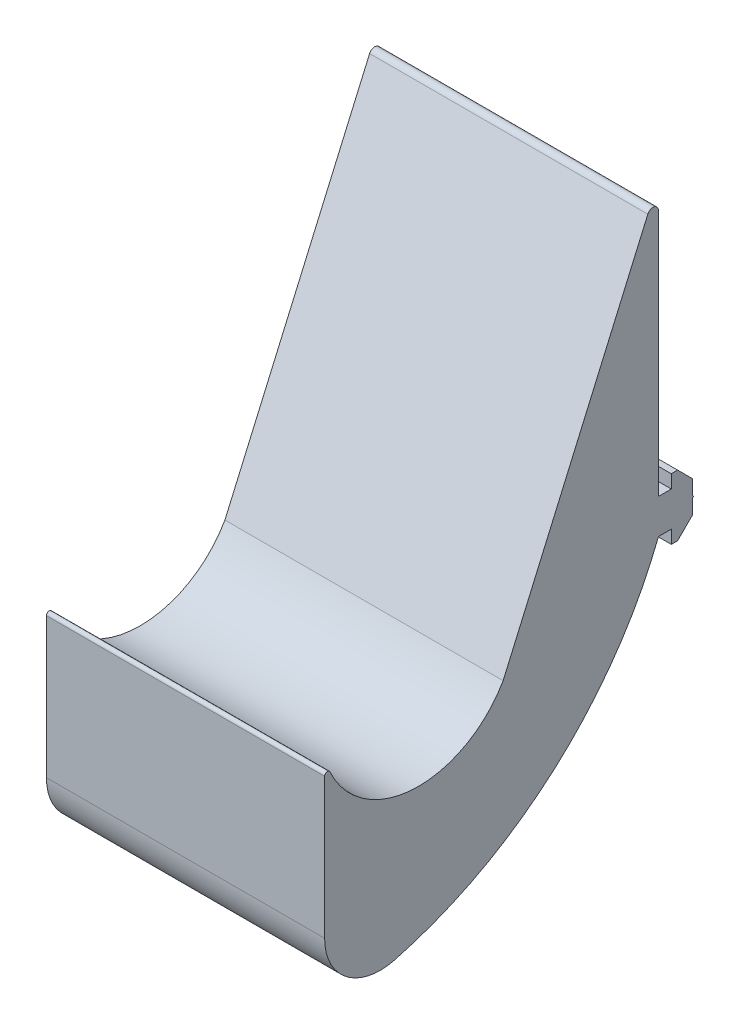
ISO-10303-21;
HEADER;
FILE_DESCRIPTION(('STEP AP214'),'2;1');
FILE_NAME('part.step','',(''),(''),'','','');
FILE_SCHEMA(('AUTOMOTIVE_DESIGN { 1 0 10303 214 1 1 1 1 }'));
ENDSEC;
DATA;
#1=APPLICATION_CONTEXT('core data for automotive mechanical design processes');
#2=APPLICATION_PROTOCOL_DEFINITION('international standard','automotive_design',2000,#1);
#3=PRODUCT_CONTEXT('',#1,'mechanical');
#4=PRODUCT('Part','Part','',(#3));
#5=PRODUCT_RELATED_PRODUCT_CATEGORY('part','',(#4));
#6=PRODUCT_DEFINITION_FORMATION('','',#4);
#7=PRODUCT_DEFINITION_CONTEXT('part definition',#1,'design');
#8=PRODUCT_DEFINITION('design','',#6,#7);
#9=PRODUCT_DEFINITION_SHAPE('','',#8);
#10=(LENGTH_UNIT() NAMED_UNIT(*) SI_UNIT(.MILLI.,.METRE.));
#11=(NAMED_UNIT(*) PLANE_ANGLE_UNIT() SI_UNIT($,.RADIAN.));
#12=(NAMED_UNIT(*) SI_UNIT($,.STERADIAN.) SOLID_ANGLE_UNIT());
#13=UNCERTAINTY_MEASURE_WITH_UNIT(LENGTH_MEASURE(1.E-05),#10,'distance_accuracy_value','');
#14=(GEOMETRIC_REPRESENTATION_CONTEXT(3) GLOBAL_UNCERTAINTY_ASSIGNED_CONTEXT((#13)) GLOBAL_UNIT_ASSIGNED_CONTEXT((#10,
#11,#12)) REPRESENTATION_CONTEXT('',''));
#15=CARTESIAN_POINT('',(0.,0.,0.));
#16=DIRECTION('',(0.,0.,1.));
#17=DIRECTION('',(1.,0.,0.));
#18=AXIS2_PLACEMENT_3D('',#15,#16,#17);
#19=CARTESIAN_POINT('',(50.,-50.,-30.));
#20=DIRECTION('',(0.,0.,1.));
#21=DIRECTION('',(1.,0.,0.));
#22=AXIS2_PLACEMENT_3D('',#19,#20,#21);
#23=PLANE('',#22);
#24=DIRECTION('',(1.,0.,0.));
#25=VECTOR('',#24,1.);
#26=CARTESIAN_POINT('',(0.,0.728575995623113,-30.));
#27=LINE('',#26,#25);
#28=CARTESIAN_POINT('',(0.,0.728575995623113,-30.));
#29=VERTEX_POINT('',#28);
#30=CARTESIAN_POINT('',(50.,0.728575995623114,-30.));
#31=VERTEX_POINT('',#30);
#32=EDGE_CURVE('E265',#29,#31,#27,.T.);
#33=ORIENTED_EDGE('',*,*,#32,.F.);
#34=DIRECTION('',(0.,1.,0.));
#35=VECTOR('',#34,1.);
#36=CARTESIAN_POINT('',(0.,-50.,-30.));
#37=LINE('',#36,#35);
#38=CARTESIAN_POINT('',(0.,45.2071519912462,-30.));
#39=VERTEX_POINT('',#38);
#40=EDGE_CURVE('E281',#29,#39,#37,.T.);
#41=ORIENTED_EDGE('',*,*,#40,.T.);
#42=DIRECTION('',(-1.,0.,0.));
#43=VECTOR('',#42,1.);
#44=CARTESIAN_POINT('',(50.,45.2071519912462,-30.));
#45=LINE('',#44,#43);
#46=CARTESIAN_POINT('',(50.,45.2071519912462,-30.));
#47=VERTEX_POINT('',#46);
#48=EDGE_CURVE('E305',#39,#47,#45,.F.);
#49=ORIENTED_EDGE('',*,*,#48,.T.);
#50=DIRECTION('',(0.,1.,0.));
#51=VECTOR('',#50,1.);
#52=CARTESIAN_POINT('',(50.,-50.,-30.));
#53=LINE('',#52,#51);
#54=EDGE_CURVE('E286',#31,#47,#53,.T.);
#55=ORIENTED_EDGE('',*,*,#54,.F.);
#56=EDGE_LOOP('',(#33,#41,#49,#55));
#57=FACE_BOUND('',#56,.T.);
#58=ADVANCED_FACE('F35',(#57),#23,.F.);
#59=CARTESIAN_POINT('',(50.,-13.9958230261597,-2.0798525217997));
#60=DIRECTION('',(0.,-0.399880657890276,-0.916567214908563));
#61=DIRECTION('',(0.,0.916567214908563,-0.399880657890276));
#62=AXIS2_PLACEMENT_3D('',#59,#60,#61);
#63=PLANE('',#62);
#64=DIRECTION('',(0.,-0.916567214908563,0.399880657890276));
#65=VECTOR('',#64,1.);
#66=CARTESIAN_POINT('',(50.,-13.9958230261597,-2.0798525217997));
#67=LINE('',#66,#65);
#68=CARTESIAN_POINT('',(50.,45.6070326491365,-28.0834327850914));
#69=VERTEX_POINT('',#68);
#70=CARTESIAN_POINT('',(50.,-13.9958230261597,-2.0798525217997));
#71=VERTEX_POINT('',#70);
#72=EDGE_CURVE('E278',#69,#71,#67,.T.);
#73=ORIENTED_EDGE('',*,*,#72,.F.);
#74=DIRECTION('',(-1.,0.,0.));
#75=VECTOR('',#74,1.);
#76=CARTESIAN_POINT('',(50.,45.6070326491365,-28.0834327850914));
#77=LINE('',#76,#75);
#78=CARTESIAN_POINT('',(0.,45.6070326491365,-28.0834327850914));
#79=VERTEX_POINT('',#78);
#80=EDGE_CURVE('E299',#69,#79,#77,.T.);
#81=ORIENTED_EDGE('',*,*,#80,.T.);
#82=DIRECTION('',(0.,-0.916567214908563,0.399880657890276));
#83=VECTOR('',#82,1.);
#84=CARTESIAN_POINT('',(0.,-13.9958230261597,-2.0798525217997));
#85=LINE('',#84,#83);
#86=CARTESIAN_POINT('',(0.,-13.9958230261597,-2.0798525217997));
#87=VERTEX_POINT('',#86);
#88=EDGE_CURVE('E251',#79,#87,#85,.T.);
#89=ORIENTED_EDGE('',*,*,#88,.T.);
#90=DIRECTION('',(-1.,0.,0.));
#91=VECTOR('',#90,1.);
#92=CARTESIAN_POINT('',(50.,-13.9958230261597,-2.0798525217997));
#93=LINE('',#92,#91);
#94=EDGE_CURVE('E288',#71,#87,#93,.T.);
#95=ORIENTED_EDGE('',*,*,#94,.F.);
#96=EDGE_LOOP('',(#73,#81,#89,#95));
#97=FACE_BOUND('',#96,.T.);
#98=ADVANCED_FACE('F348',(#97),#63,.F.);
#99=CARTESIAN_POINT('',(50.,-5.34269309762879,13.1311087377645));
#100=DIRECTION('',(-1.,0.,0.));
#101=DIRECTION('',(0.,0.,1.));
#102=AXIS2_PLACEMENT_3D('',#99,#100,#101);
#103=CYLINDRICAL_SURFACE('',#102,17.5);
#104=CARTESIAN_POINT('',(0.,-5.34269309762879,13.1311087377645));
#105=DIRECTION('',(-1.,0.,0.));
#106=DIRECTION('',(0.,0.,-1.));
#107=AXIS2_PLACEMENT_3D('',#104,#105,#106);
#108=CIRCLE('',#107,17.5);
#109=CARTESIAN_POINT('',(0.,-12.6219955028834,29.045308576049));
#110=VERTEX_POINT('',#109);
#111=EDGE_CURVE('E290',#87,#110,#108,.T.);
#112=ORIENTED_EDGE('',*,*,#111,.T.);
#113=DIRECTION('',(-1.,0.,0.));
#114=VECTOR('',#113,1.);
#115=CARTESIAN_POINT('',(50.,-12.6219955028834,29.045308576049));
#116=LINE('',#115,#114);
#117=CARTESIAN_POINT('',(50.,-12.6219955028834,29.045308576049));
#118=VERTEX_POINT('',#117);
#119=EDGE_CURVE('E315',#110,#118,#116,.F.);
#120=ORIENTED_EDGE('',*,*,#119,.T.);
#121=CARTESIAN_POINT('',(50.,-5.34269309762879,13.1311087377645));
#122=DIRECTION('',(-1.,0.,0.));
#123=DIRECTION('',(0.,0.,-1.));
#124=AXIS2_PLACEMENT_3D('',#121,#122,#123);
#125=CIRCLE('',#124,17.5);
#126=EDGE_CURVE('E280',#71,#118,#125,.T.);
#127=ORIENTED_EDGE('',*,*,#126,.F.);
#128=ORIENTED_EDGE('',*,*,#94,.T.);
#129=EDGE_LOOP('',(#112,#120,#127,#128));
#130=FACE_BOUND('',#129,.T.);
#131=ADVANCED_FACE('F354',(#130),#103,.F.);
#132=CARTESIAN_POINT('',(50.,-50.,30.));
#133=DIRECTION('',(0.,0.,-1.));
#134=DIRECTION('',(0.,1.,0.));
#135=AXIS2_PLACEMENT_3D('',#132,#133,#134);
#136=PLANE('',#135);
#137=DIRECTION('',(0.,-1.,0.));
#138=VECTOR('',#137,1.);
#139=CARTESIAN_POINT('',(0.,-50.,30.));
#140=LINE('',#139,#138);
#141=CARTESIAN_POINT('',(0.,-12.8299755716049,30.));
#142=VERTEX_POINT('',#141);
#143=CARTESIAN_POINT('',(0.,-38.0475262971483,30.));
#144=VERTEX_POINT('',#143);
#145=EDGE_CURVE('E293',#142,#144,#140,.T.);
#146=ORIENTED_EDGE('',*,*,#145,.T.);
#147=DIRECTION('',(-1.,0.,0.));
#148=VECTOR('',#147,1.);
#149=CARTESIAN_POINT('',(50.,-38.0475262971483,30.));
#150=LINE('',#149,#148);
#151=CARTESIAN_POINT('',(50.,-38.0475262971483,30.));
#152=VERTEX_POINT('',#151);
#153=EDGE_CURVE('E323',#144,#152,#150,.F.);
#154=ORIENTED_EDGE('',*,*,#153,.T.);
#155=DIRECTION('',(0.,-1.,0.));
#156=VECTOR('',#155,1.);
#157=CARTESIAN_POINT('',(50.,-50.,30.));
#158=LINE('',#157,#156);
#159=CARTESIAN_POINT('',(50.,-12.8299755716049,30.));
#160=VERTEX_POINT('',#159);
#161=EDGE_CURVE('E284',#160,#152,#158,.T.);
#162=ORIENTED_EDGE('',*,*,#161,.F.);
#163=DIRECTION('',(-1.,0.,0.));
#164=VECTOR('',#163,1.);
#165=CARTESIAN_POINT('',(50.,-12.8299755716049,30.));
#166=LINE('',#165,#164);
#167=EDGE_CURVE('E310',#160,#142,#166,.T.);
#168=ORIENTED_EDGE('',*,*,#167,.T.);
#169=EDGE_LOOP('',(#146,#154,#162,#168));
#170=FACE_BOUND('',#169,.T.);
#171=ADVANCED_FACE('F329',(#170),#136,.F.);
#172=CARTESIAN_POINT('',(50.,-5.34269309762879,13.1311087377645));
#173=DIRECTION('',(1.,0.,0.));
#174=DIRECTION('',(0.,0.,-1.));
#175=AXIS2_PLACEMENT_3D('',#172,#173,#174);
#176=PLANE('',#175);
#177=ORIENTED_EDGE('',*,*,#161,.T.);
#178=CARTESIAN_POINT('',(50.,-38.0475262971483,20.));
#179=DIRECTION('',(1.,0.,0.));
#180=DIRECTION('',(0.,0.,-1.));
#181=AXIS2_PLACEMENT_3D('',#178,#179,#180);
#182=CIRCLE('',#181,10.);
#183=CARTESIAN_POINT('',(50.,-47.7221140133396,17.4697129566551));
#184=VERTEX_POINT('',#183);
#185=EDGE_CURVE('E57',#152,#184,#182,.T.);
#186=ORIENTED_EDGE('',*,*,#185,.T.);
#187=CARTESIAN_POINT('',(50.,20.,35.1817222600693));
#188=DIRECTION('',(1.,0.,0.));
#189=DIRECTION('',(0.,0.,-1.));
#190=AXIS2_PLACEMENT_3D('',#187,#188,#189);
#191=CIRCLE('',#190,70.);
#192=CARTESIAN_POINT('',(50.,-5.5214240043769,-30.));
#193=VERTEX_POINT('',#192);
#194=EDGE_CURVE('E321',#184,#193,#191,.T.);
#195=ORIENTED_EDGE('',*,*,#194,.T.);
#196=DIRECTION('',(0.,0.,-1.));
#197=VECTOR('',#196,1.);
#198=CARTESIAN_POINT('',(50.,-5.5214240043769,0.));
#199=LINE('',#198,#197);
#200=CARTESIAN_POINT('',(50.,-5.5214240043769,-32.3));
#201=VERTEX_POINT('',#200);
#202=EDGE_CURVE('E238',#193,#201,#199,.T.);
#203=ORIENTED_EDGE('',*,*,#202,.T.);
#204=DIRECTION('',(0.,-1.,0.));
#205=VECTOR('',#204,1.);
#206=CARTESIAN_POINT('',(50.,0.,-32.3));
#207=LINE('',#206,#205);
#208=CARTESIAN_POINT('',(50.,-7.89642400437688,-32.3));
#209=VERTEX_POINT('',#208);
#210=EDGE_CURVE('E241',#201,#209,#207,.T.);
#211=ORIENTED_EDGE('',*,*,#210,.T.);
#212=DIRECTION('',(0.,0.,1.));
#213=VECTOR('',#212,1.);
#214=CARTESIAN_POINT('',(50.,-7.89642400437703,0.));
#215=LINE('',#214,#213);
#216=CARTESIAN_POINT('',(50.,-7.89642400437688,-33.4393398282203));
#217=VERTEX_POINT('',#216);
#218=EDGE_CURVE('E244',#217,#209,#215,.T.);
#219=ORIENTED_EDGE('',*,*,#218,.F.);
#220=DIRECTION('',(0.,-0.707106781186554,0.707106781186541));
#221=VECTOR('',#220,1.);
#222=CARTESIAN_POINT('',(50.,-20.6678819162985,-20.6678819162989));
#223=LINE('',#222,#221);
#224=CARTESIAN_POINT('',(50.,-5.23576383259709,-36.1));
#225=VERTEX_POINT('',#224);
#226=EDGE_CURVE('E247',#225,#217,#223,.T.);
#227=ORIENTED_EDGE('',*,*,#226,.F.);
#228=DIRECTION('',(0.,-1.,0.));
#229=VECTOR('',#228,1.);
#230=CARTESIAN_POINT('',(50.,1.90537614988025E-13,-36.1));
#231=LINE('',#230,#229);
#232=CARTESIAN_POINT('',(50.,-2.60642400437688,-36.1));
#233=VERTEX_POINT('',#232);
#234=EDGE_CURVE('E190',#233,#225,#231,.T.);
#235=ORIENTED_EDGE('',*,*,#234,.F.);
#236=DIRECTION('',(0.,-0.70710678118655,0.707106781186545));
#237=VECTOR('',#236,1.);
#238=CARTESIAN_POINT('',(50.,-19.3532120021884,-19.3532120021885));
#239=LINE('',#238,#237);
#240=CARTESIAN_POINT('',(50.,-2.39642400437687,-36.31));
#241=VERTEX_POINT('',#240);
#242=EDGE_CURVE('E221',#241,#233,#239,.T.);
#243=ORIENTED_EDGE('',*,*,#242,.F.);
#244=DIRECTION('',(0.,0.707106781186548,0.707106781186548));
#245=VECTOR('',#244,1.);
#246=CARTESIAN_POINT('',(50.,16.9567879978116,-16.9567879978116));
#247=LINE('',#246,#245);
#248=CARTESIAN_POINT('',(50.,-2.18642400437687,-36.1));
#249=VERTEX_POINT('',#248);
#250=EDGE_CURVE('E176',#241,#249,#247,.T.);
#251=ORIENTED_EDGE('',*,*,#250,.T.);
#252=DIRECTION('',(0.,1.,0.));
#253=VECTOR('',#252,1.);
#254=CARTESIAN_POINT('',(50.,0.,-36.1));
#255=LINE('',#254,#253);
#256=CARTESIAN_POINT('',(50.,0.442915823843343,-36.1));
#257=VERTEX_POINT('',#256);
#258=EDGE_CURVE('E224',#249,#257,#255,.T.);
#259=ORIENTED_EDGE('',*,*,#258,.T.);
#260=DIRECTION('',(0.,0.707106781186549,0.707106781186546));
#261=VECTOR('',#260,1.);
#262=CARTESIAN_POINT('',(50.,18.2714579119217,-18.2714579119217));
#263=LINE('',#262,#261);
#264=CARTESIAN_POINT('',(50.,3.10357599562312,-33.4393398282202));
#265=VERTEX_POINT('',#264);
#266=EDGE_CURVE('E227',#257,#265,#263,.T.);
#267=ORIENTED_EDGE('',*,*,#266,.T.);
#268=DIRECTION('',(0.,0.,1.));
#269=VECTOR('',#268,1.);
#270=CARTESIAN_POINT('',(50.,3.10357599562299,0.));
#271=LINE('',#270,#269);
#272=CARTESIAN_POINT('',(50.,3.1035759956231,-32.3));
#273=VERTEX_POINT('',#272);
#274=EDGE_CURVE('E230',#265,#273,#271,.T.);
#275=ORIENTED_EDGE('',*,*,#274,.T.);
#276=DIRECTION('',(0.,1.,0.));
#277=VECTOR('',#276,1.);
#278=CARTESIAN_POINT('',(50.,2.83106871279417E-13,-32.3));
#279=LINE('',#278,#277);
#280=CARTESIAN_POINT('',(50.,0.728575995623121,-32.3));
#281=VERTEX_POINT('',#280);
#282=EDGE_CURVE('E233',#281,#273,#279,.T.);
#283=ORIENTED_EDGE('',*,*,#282,.F.);
#284=DIRECTION('',(0.,0.,-1.));
#285=VECTOR('',#284,1.);
#286=CARTESIAN_POINT('',(50.,0.728575995622889,0.));
#287=LINE('',#286,#285);
#288=EDGE_CURVE('E236',#31,#281,#287,.T.);
#289=ORIENTED_EDGE('',*,*,#288,.F.);
#290=ORIENTED_EDGE('',*,*,#54,.T.);
#291=CARTESIAN_POINT('',(50.,45.2071519912462,-29.));
#292=DIRECTION('',(1.,0.,0.));
#293=DIRECTION('',(0.,0.,-1.));
#294=AXIS2_PLACEMENT_3D('',#291,#292,#293);
#295=CIRCLE('',#294,1.);
#296=EDGE_CURVE('E308',#47,#69,#295,.T.);
#297=ORIENTED_EDGE('',*,*,#296,.T.);
#298=ORIENTED_EDGE('',*,*,#72,.T.);
#299=ORIENTED_EDGE('',*,*,#126,.T.);
#300=CARTESIAN_POINT('',(50.,-12.8299755716049,29.5));
#301=DIRECTION('',(1.,0.,0.));
#302=DIRECTION('',(0.,0.,-1.));
#303=AXIS2_PLACEMENT_3D('',#300,#301,#302);
#304=CIRCLE('',#303,0.5);
#305=EDGE_CURVE('E317',#118,#160,#304,.T.);
#306=ORIENTED_EDGE('',*,*,#305,.T.);
#307=EDGE_LOOP('',(#177,#186,#195,#203,#211,#219,#227,#235,#243,#251,#259,#267,#275,#283,#289,
#290,#297,#298,#299,#306));
#308=FACE_BOUND('',#307,.T.);
#309=ADVANCED_FACE('F334',(#308),#176,.T.);
#310=CARTESIAN_POINT('',(0.,-5.34269309762879,13.1311087377645));
#311=DIRECTION('',(1.,0.,0.));
#312=DIRECTION('',(0.,0.,-1.));
#313=AXIS2_PLACEMENT_3D('',#310,#311,#312);
#314=PLANE('',#313);
#315=CARTESIAN_POINT('',(0.,20.,35.1817222600693));
#316=DIRECTION('',(1.,0.,0.));
#317=DIRECTION('',(0.,0.,-1.));
#318=AXIS2_PLACEMENT_3D('',#315,#316,#317);
#319=CIRCLE('',#318,70.);
#320=CARTESIAN_POINT('',(0.,-5.5214240043769,-30.));
#321=VERTEX_POINT('',#320);
#322=CARTESIAN_POINT('',(0.,-47.7221140133396,17.4697129566551));
#323=VERTEX_POINT('',#322);
#324=EDGE_CURVE('E319',#321,#323,#319,.F.);
#325=ORIENTED_EDGE('',*,*,#324,.T.);
#326=CARTESIAN_POINT('',(0.,-38.0475262971483,20.));
#327=DIRECTION('',(1.,0.,0.));
#328=DIRECTION('',(0.,0.,-1.));
#329=AXIS2_PLACEMENT_3D('',#326,#327,#328);
#330=CIRCLE('',#329,10.);
#331=EDGE_CURVE('E11',#323,#144,#330,.F.);
#332=ORIENTED_EDGE('',*,*,#331,.T.);
#333=ORIENTED_EDGE('',*,*,#145,.F.);
#334=CARTESIAN_POINT('',(0.,-12.8299755716049,29.5));
#335=DIRECTION('',(1.,0.,0.));
#336=DIRECTION('',(0.,0.,-1.));
#337=AXIS2_PLACEMENT_3D('',#334,#335,#336);
#338=CIRCLE('',#337,0.5);
#339=EDGE_CURVE('E313',#142,#110,#338,.F.);
#340=ORIENTED_EDGE('',*,*,#339,.T.);
#341=ORIENTED_EDGE('',*,*,#111,.F.);
#342=ORIENTED_EDGE('',*,*,#88,.F.);
#343=CARTESIAN_POINT('',(0.,45.2071519912462,-29.));
#344=DIRECTION('',(1.,0.,0.));
#345=DIRECTION('',(0.,0.,-1.));
#346=AXIS2_PLACEMENT_3D('',#343,#344,#345);
#347=CIRCLE('',#346,1.);
#348=EDGE_CURVE('E302',#79,#39,#347,.F.);
#349=ORIENTED_EDGE('',*,*,#348,.T.);
#350=ORIENTED_EDGE('',*,*,#40,.F.);
#351=DIRECTION('',(0.,0.,-1.));
#352=VECTOR('',#351,1.);
#353=CARTESIAN_POINT('',(0.,0.728575995622889,0.));
#354=LINE('',#353,#352);
#355=CARTESIAN_POINT('',(0.,0.728575995623121,-32.3));
#356=VERTEX_POINT('',#355);
#357=EDGE_CURVE('E208',#29,#356,#354,.T.);
#358=ORIENTED_EDGE('',*,*,#357,.T.);
#359=DIRECTION('',(0.,1.,0.));
#360=VECTOR('',#359,1.);
#361=CARTESIAN_POINT('',(0.,2.83106871279417E-13,-32.3));
#362=LINE('',#361,#360);
#363=CARTESIAN_POINT('',(0.,3.1035759956231,-32.3));
#364=VERTEX_POINT('',#363);
#365=EDGE_CURVE('E206',#356,#364,#362,.T.);
#366=ORIENTED_EDGE('',*,*,#365,.T.);
#367=DIRECTION('',(0.,0.,1.));
#368=VECTOR('',#367,1.);
#369=CARTESIAN_POINT('',(0.,3.10357599562299,0.));
#370=LINE('',#369,#368);
#371=CARTESIAN_POINT('',(0.,3.10357599562312,-33.4393398282202));
#372=VERTEX_POINT('',#371);
#373=EDGE_CURVE('E203',#372,#364,#370,.T.);
#374=ORIENTED_EDGE('',*,*,#373,.F.);
#375=DIRECTION('',(0.,0.707106781186549,0.707106781186546));
#376=VECTOR('',#375,1.);
#377=CARTESIAN_POINT('',(0.,18.2714579119217,-18.2714579119217));
#378=LINE('',#377,#376);
#379=CARTESIAN_POINT('',(0.,0.442915823843343,-36.1));
#380=VERTEX_POINT('',#379);
#381=EDGE_CURVE('E198',#380,#372,#378,.T.);
#382=ORIENTED_EDGE('',*,*,#381,.F.);
#383=DIRECTION('',(0.,1.,0.));
#384=VECTOR('',#383,1.);
#385=CARTESIAN_POINT('',(0.,0.,-36.1));
#386=LINE('',#385,#384);
#387=CARTESIAN_POINT('',(0.,-2.18642400437687,-36.1));
#388=VERTEX_POINT('',#387);
#389=EDGE_CURVE('E196',#388,#380,#386,.T.);
#390=ORIENTED_EDGE('',*,*,#389,.F.);
#391=DIRECTION('',(0.,0.707106781186548,0.707106781186548));
#392=VECTOR('',#391,1.);
#393=CARTESIAN_POINT('',(0.,16.9567879978116,-16.9567879978116));
#394=LINE('',#393,#392);
#395=CARTESIAN_POINT('',(0.,-2.39642400437687,-36.31));
#396=VERTEX_POINT('',#395);
#397=EDGE_CURVE('E174',#396,#388,#394,.T.);
#398=ORIENTED_EDGE('',*,*,#397,.F.);
#399=DIRECTION('',(0.,-0.70710678118655,0.707106781186545));
#400=VECTOR('',#399,1.);
#401=CARTESIAN_POINT('',(0.,-19.3532120021884,-19.3532120021885));
#402=LINE('',#401,#400);
#403=CARTESIAN_POINT('',(0.,-2.60642400437688,-36.1));
#404=VERTEX_POINT('',#403);
#405=EDGE_CURVE('E185',#396,#404,#402,.T.);
#406=ORIENTED_EDGE('',*,*,#405,.T.);
#407=DIRECTION('',(0.,-1.,0.));
#408=VECTOR('',#407,1.);
#409=CARTESIAN_POINT('',(0.,1.90537614988025E-13,-36.1));
#410=LINE('',#409,#408);
#411=CARTESIAN_POINT('',(0.,-5.23576383259709,-36.1));
#412=VERTEX_POINT('',#411);
#413=EDGE_CURVE('E181',#404,#412,#410,.T.);
#414=ORIENTED_EDGE('',*,*,#413,.T.);
#415=DIRECTION('',(0.,-0.707106781186554,0.707106781186541));
#416=VECTOR('',#415,1.);
#417=CARTESIAN_POINT('',(0.,-20.6678819162985,-20.6678819162989));
#418=LINE('',#417,#416);
#419=CARTESIAN_POINT('',(0.,-7.89642400437688,-33.4393398282203));
#420=VERTEX_POINT('',#419);
#421=EDGE_CURVE('E218',#412,#420,#418,.T.);
#422=ORIENTED_EDGE('',*,*,#421,.T.);
#423=DIRECTION('',(0.,0.,1.));
#424=VECTOR('',#423,1.);
#425=CARTESIAN_POINT('',(0.,-7.89642400437703,0.));
#426=LINE('',#425,#424);
#427=CARTESIAN_POINT('',(0.,-7.89642400437688,-32.3));
#428=VERTEX_POINT('',#427);
#429=EDGE_CURVE('E216',#420,#428,#426,.T.);
#430=ORIENTED_EDGE('',*,*,#429,.T.);
#431=DIRECTION('',(0.,-1.,0.));
#432=VECTOR('',#431,1.);
#433=CARTESIAN_POINT('',(0.,0.,-32.3));
#434=LINE('',#433,#432);
#435=CARTESIAN_POINT('',(0.,-5.5214240043769,-32.3));
#436=VERTEX_POINT('',#435);
#437=EDGE_CURVE('E213',#436,#428,#434,.T.);
#438=ORIENTED_EDGE('',*,*,#437,.F.);
#439=DIRECTION('',(0.,0.,-1.));
#440=VECTOR('',#439,1.);
#441=CARTESIAN_POINT('',(0.,-5.5214240043769,0.));
#442=LINE('',#441,#440);
#443=EDGE_CURVE('E210',#321,#436,#442,.T.);
#444=ORIENTED_EDGE('',*,*,#443,.F.);
#445=EDGE_LOOP('',(#325,#332,#333,#340,#341,#342,#349,#350,#358,#366,#374,#382,#390,#398,#406,
#414,#422,#430,#438,#444));
#446=FACE_BOUND('',#445,.T.);
#447=ADVANCED_FACE('F193',(#446),#314,.F.);
#448=CARTESIAN_POINT('',(50.,45.2071519912462,-29.));
#449=DIRECTION('',(-1.,0.,0.));
#450=DIRECTION('',(0.,0.,1.));
#451=AXIS2_PLACEMENT_3D('',#448,#449,#450);
#452=CYLINDRICAL_SURFACE('',#451,1.);
#453=ORIENTED_EDGE('',*,*,#296,.F.);
#454=ORIENTED_EDGE('',*,*,#48,.F.);
#455=ORIENTED_EDGE('',*,*,#348,.F.);
#456=ORIENTED_EDGE('',*,*,#80,.F.);
#457=EDGE_LOOP('',(#453,#454,#455,#456));
#458=FACE_BOUND('',#457,.T.);
#459=ADVANCED_FACE('F366',(#458),#452,.T.);
#460=CARTESIAN_POINT('',(50.,-12.8299755716049,29.5));
#461=DIRECTION('',(-1.,0.,0.));
#462=DIRECTION('',(0.,0.,1.));
#463=AXIS2_PLACEMENT_3D('',#460,#461,#462);
#464=CYLINDRICAL_SURFACE('',#463,0.5);
#465=ORIENTED_EDGE('',*,*,#305,.F.);
#466=ORIENTED_EDGE('',*,*,#119,.F.);
#467=ORIENTED_EDGE('',*,*,#339,.F.);
#468=ORIENTED_EDGE('',*,*,#167,.F.);
#469=EDGE_LOOP('',(#465,#466,#467,#468));
#470=FACE_BOUND('',#469,.T.);
#471=ADVANCED_FACE('F339',(#470),#464,.T.);
#472=CARTESIAN_POINT('',(0.,-19.3532120021884,-19.3532120021885));
#473=DIRECTION('',(0.,0.707106781186545,0.70710678118655));
#474=DIRECTION('',(0.,-0.70710678118655,0.707106781186545));
#475=AXIS2_PLACEMENT_3D('',#472,#473,#474);
#476=PLANE('',#475);
#477=ORIENTED_EDGE('',*,*,#242,.T.);
#478=DIRECTION('',(1.,0.,0.));
#479=VECTOR('',#478,1.);
#480=CARTESIAN_POINT('',(0.,-2.60642400437688,-36.1));
#481=LINE('',#480,#479);
#482=EDGE_CURVE('E188',#404,#233,#481,.T.);
#483=ORIENTED_EDGE('',*,*,#482,.F.);
#484=ORIENTED_EDGE('',*,*,#405,.F.);
#485=DIRECTION('',(1.,0.,0.));
#486=VECTOR('',#485,1.);
#487=CARTESIAN_POINT('',(0.,-2.39642400437687,-36.31));
#488=LINE('',#487,#486);
#489=EDGE_CURVE('E170',#396,#241,#488,.T.);
#490=ORIENTED_EDGE('',*,*,#489,.T.);
#491=EDGE_LOOP('',(#477,#483,#484,#490));
#492=FACE_BOUND('',#491,.T.);
#493=ADVANCED_FACE('F186',(#492),#476,.F.);
#494=CARTESIAN_POINT('',(0.,1.90537614988025E-13,-36.1));
#495=DIRECTION('',(0.,0.,1.));
#496=DIRECTION('',(0.,-1.,0.));
#497=AXIS2_PLACEMENT_3D('',#494,#495,#496);
#498=PLANE('',#497);
#499=ORIENTED_EDGE('',*,*,#234,.T.);
#500=DIRECTION('',(1.,0.,0.));
#501=VECTOR('',#500,1.);
#502=CARTESIAN_POINT('',(0.,-5.23576383259709,-36.1));
#503=LINE('',#502,#501);
#504=EDGE_CURVE('E252',#412,#225,#503,.T.);
#505=ORIENTED_EDGE('',*,*,#504,.F.);
#506=ORIENTED_EDGE('',*,*,#413,.F.);
#507=ORIENTED_EDGE('',*,*,#482,.T.);
#508=EDGE_LOOP('',(#499,#505,#506,#507));
#509=FACE_BOUND('',#508,.T.);
#510=ADVANCED_FACE('F374',(#509),#498,.F.);
#511=CARTESIAN_POINT('',(0.,-20.6678819162985,-20.6678819162989));
#512=DIRECTION('',(0.,0.707106781186541,0.707106781186554));
#513=DIRECTION('',(0.,-0.707106781186554,0.707106781186541));
#514=AXIS2_PLACEMENT_3D('',#511,#512,#513);
#515=PLANE('',#514);
#516=ORIENTED_EDGE('',*,*,#226,.T.);
#517=DIRECTION('',(1.,0.,0.));
#518=VECTOR('',#517,1.);
#519=CARTESIAN_POINT('',(0.,-7.89642400437688,-33.4393398282203));
#520=LINE('',#519,#518);
#521=EDGE_CURVE('E255',#420,#217,#520,.T.);
#522=ORIENTED_EDGE('',*,*,#521,.F.);
#523=ORIENTED_EDGE('',*,*,#421,.F.);
#524=ORIENTED_EDGE('',*,*,#504,.T.);
#525=EDGE_LOOP('',(#516,#522,#523,#524));
#526=FACE_BOUND('',#525,.T.);
#527=ADVANCED_FACE('F379',(#526),#515,.F.);
#528=CARTESIAN_POINT('',(0.,-7.89642400437703,0.));
#529=DIRECTION('',(0.,1.,0.));
#530=DIRECTION('',(0.,0.,1.));
#531=AXIS2_PLACEMENT_3D('',#528,#529,#530);
#532=PLANE('',#531);
#533=ORIENTED_EDGE('',*,*,#218,.T.);
#534=DIRECTION('',(1.,0.,0.));
#535=VECTOR('',#534,1.);
#536=CARTESIAN_POINT('',(0.,-7.89642400437688,-32.3));
#537=LINE('',#536,#535);
#538=EDGE_CURVE('E258',#428,#209,#537,.T.);
#539=ORIENTED_EDGE('',*,*,#538,.F.);
#540=ORIENTED_EDGE('',*,*,#429,.F.);
#541=ORIENTED_EDGE('',*,*,#521,.T.);
#542=EDGE_LOOP('',(#533,#539,#540,#541));
#543=FACE_BOUND('',#542,.T.);
#544=ADVANCED_FACE('F434',(#543),#532,.F.);
#545=CARTESIAN_POINT('',(0.,0.,-32.3));
#546=DIRECTION('',(0.,0.,1.));
#547=DIRECTION('',(1.,0.,0.));
#548=AXIS2_PLACEMENT_3D('',#545,#546,#547);
#549=PLANE('',#548);
#550=ORIENTED_EDGE('',*,*,#210,.F.);
#551=DIRECTION('',(1.,0.,0.));
#552=VECTOR('',#551,1.);
#553=CARTESIAN_POINT('',(0.,-5.5214240043769,-32.3));
#554=LINE('',#553,#552);
#555=EDGE_CURVE('E260',#436,#201,#554,.T.);
#556=ORIENTED_EDGE('',*,*,#555,.F.);
#557=ORIENTED_EDGE('',*,*,#437,.T.);
#558=ORIENTED_EDGE('',*,*,#538,.T.);
#559=EDGE_LOOP('',(#550,#556,#557,#558));
#560=FACE_BOUND('',#559,.T.);
#561=ADVANCED_FACE('F444',(#560),#549,.T.);
#562=CARTESIAN_POINT('',(0.,-5.5214240043769,0.));
#563=DIRECTION('',(0.,-1.,0.));
#564=DIRECTION('',(0.,0.,-1.));
#565=AXIS2_PLACEMENT_3D('',#562,#563,#564);
#566=PLANE('',#565);
#567=ORIENTED_EDGE('',*,*,#202,.F.);
#568=DIRECTION('',(1.,0.,0.));
#569=VECTOR('',#568,1.);
#570=CARTESIAN_POINT('',(0.,-5.5214240043769,-30.));
#571=LINE('',#570,#569);
#572=EDGE_CURVE('E262',#321,#193,#571,.T.);
#573=ORIENTED_EDGE('',*,*,#572,.F.);
#574=ORIENTED_EDGE('',*,*,#443,.T.);
#575=ORIENTED_EDGE('',*,*,#555,.T.);
#576=EDGE_LOOP('',(#567,#573,#574,#575));
#577=FACE_BOUND('',#576,.T.);
#578=ADVANCED_FACE('F454',(#577),#566,.T.);
#579=CARTESIAN_POINT('',(0.,0.728575995622889,0.));
#580=DIRECTION('',(0.,-1.,0.));
#581=DIRECTION('',(0.,0.,-1.));
#582=AXIS2_PLACEMENT_3D('',#579,#580,#581);
#583=PLANE('',#582);
#584=ORIENTED_EDGE('',*,*,#288,.T.);
#585=DIRECTION('',(1.,0.,0.));
#586=VECTOR('',#585,1.);
#587=CARTESIAN_POINT('',(0.,0.728575995623121,-32.3));
#588=LINE('',#587,#586);
#589=EDGE_CURVE('E268',#356,#281,#588,.T.);
#590=ORIENTED_EDGE('',*,*,#589,.F.);
#591=ORIENTED_EDGE('',*,*,#357,.F.);
#592=ORIENTED_EDGE('',*,*,#32,.T.);
#593=EDGE_LOOP('',(#584,#590,#591,#592));
#594=FACE_BOUND('',#593,.T.);
#595=ADVANCED_FACE('F462',(#594),#583,.F.);
#596=CARTESIAN_POINT('',(0.,2.83106871279417E-13,-32.3));
#597=DIRECTION('',(0.,0.,-1.));
#598=DIRECTION('',(0.,1.,0.));
#599=AXIS2_PLACEMENT_3D('',#596,#597,#598);
#600=PLANE('',#599);
#601=ORIENTED_EDGE('',*,*,#282,.T.);
#602=DIRECTION('',(1.,0.,0.));
#603=VECTOR('',#602,1.);
#604=CARTESIAN_POINT('',(0.,3.1035759956231,-32.3));
#605=LINE('',#604,#603);
#606=EDGE_CURVE('E271',#364,#273,#605,.T.);
#607=ORIENTED_EDGE('',*,*,#606,.F.);
#608=ORIENTED_EDGE('',*,*,#365,.F.);
#609=ORIENTED_EDGE('',*,*,#589,.T.);
#610=EDGE_LOOP('',(#601,#607,#608,#609));
#611=FACE_BOUND('',#610,.T.);
#612=ADVANCED_FACE('F467',(#611),#600,.F.);
#613=CARTESIAN_POINT('',(0.,3.10357599562299,0.));
#614=DIRECTION('',(0.,1.,0.));
#615=DIRECTION('',(0.,0.,1.));
#616=AXIS2_PLACEMENT_3D('',#613,#614,#615);
#617=PLANE('',#616);
#618=ORIENTED_EDGE('',*,*,#274,.F.);
#619=DIRECTION('',(1.,0.,0.));
#620=VECTOR('',#619,1.);
#621=CARTESIAN_POINT('',(0.,3.10357599562312,-33.4393398282202));
#622=LINE('',#621,#620);
#623=EDGE_CURVE('E273',#372,#265,#622,.T.);
#624=ORIENTED_EDGE('',*,*,#623,.F.);
#625=ORIENTED_EDGE('',*,*,#373,.T.);
#626=ORIENTED_EDGE('',*,*,#606,.T.);
#627=EDGE_LOOP('',(#618,#624,#625,#626));
#628=FACE_BOUND('',#627,.T.);
#629=ADVANCED_FACE('F478',(#628),#617,.T.);
#630=CARTESIAN_POINT('',(0.,18.2714579119217,-18.2714579119217));
#631=DIRECTION('',(0.,0.707106781186547,-0.707106781186549));
#632=DIRECTION('',(0.,0.707106781186549,0.707106781186547));
#633=AXIS2_PLACEMENT_3D('',#630,#631,#632);
#634=PLANE('',#633);
#635=ORIENTED_EDGE('',*,*,#266,.F.);
#636=DIRECTION('',(1.,0.,0.));
#637=VECTOR('',#636,1.);
#638=CARTESIAN_POINT('',(0.,0.442915823843343,-36.1));
#639=LINE('',#638,#637);
#640=EDGE_CURVE('E275',#380,#257,#639,.T.);
#641=ORIENTED_EDGE('',*,*,#640,.F.);
#642=ORIENTED_EDGE('',*,*,#381,.T.);
#643=ORIENTED_EDGE('',*,*,#623,.T.);
#644=EDGE_LOOP('',(#635,#641,#642,#643));
#645=FACE_BOUND('',#644,.T.);
#646=ADVANCED_FACE('F488',(#645),#634,.T.);
#647=CARTESIAN_POINT('',(0.,0.,-36.1));
#648=DIRECTION('',(0.,0.,-1.));
#649=DIRECTION('',(0.,1.,0.));
#650=AXIS2_PLACEMENT_3D('',#647,#648,#649);
#651=PLANE('',#650);
#652=ORIENTED_EDGE('',*,*,#258,.F.);
#653=DIRECTION('',(1.,0.,0.));
#654=VECTOR('',#653,1.);
#655=CARTESIAN_POINT('',(0.,-2.18642400437687,-36.1));
#656=LINE('',#655,#654);
#657=EDGE_CURVE('E180',#388,#249,#656,.T.);
#658=ORIENTED_EDGE('',*,*,#657,.F.);
#659=ORIENTED_EDGE('',*,*,#389,.T.);
#660=ORIENTED_EDGE('',*,*,#640,.T.);
#661=EDGE_LOOP('',(#652,#658,#659,#660));
#662=FACE_BOUND('',#661,.T.);
#663=ADVANCED_FACE('F498',(#662),#651,.T.);
#664=CARTESIAN_POINT('',(0.,16.9567879978116,-16.9567879978116));
#665=DIRECTION('',(0.,0.707106781186548,-0.707106781186548));
#666=DIRECTION('',(0.,0.707106781186548,0.707106781186548));
#667=AXIS2_PLACEMENT_3D('',#664,#665,#666);
#668=PLANE('',#667);
#669=ORIENTED_EDGE('',*,*,#250,.F.);
#670=ORIENTED_EDGE('',*,*,#489,.F.);
#671=ORIENTED_EDGE('',*,*,#397,.T.);
#672=ORIENTED_EDGE('',*,*,#657,.T.);
#673=EDGE_LOOP('',(#669,#670,#671,#672));
#674=FACE_BOUND('',#673,.T.);
#675=ADVANCED_FACE('F172',(#674),#668,.T.);
#676=CARTESIAN_POINT('',(50.,20.,35.1817222600693));
#677=DIRECTION('',(1.,0.,0.));
#678=DIRECTION('',(0.,0.,-1.));
#679=AXIS2_PLACEMENT_3D('',#676,#677,#678);
#680=CYLINDRICAL_SURFACE('',#679,70.);
#681=ORIENTED_EDGE('',*,*,#194,.F.);
#682=DIRECTION('',(1.,0.,0.));
#683=VECTOR('',#682,1.);
#684=CARTESIAN_POINT('',(50.,-47.7221140133396,17.4697129566551));
#685=LINE('',#684,#683);
#686=EDGE_CURVE('E43',#184,#323,#685,.F.);
#687=ORIENTED_EDGE('',*,*,#686,.T.);
#688=ORIENTED_EDGE('',*,*,#324,.F.);
#689=ORIENTED_EDGE('',*,*,#572,.T.);
#690=EDGE_LOOP('',(#681,#687,#688,#689));
#691=FACE_BOUND('',#690,.T.);
#692=ADVANCED_FACE('F343',(#691),#680,.T.);
#693=CARTESIAN_POINT('',(50.,-38.0475262971483,20.));
#694=DIRECTION('',(1.,0.,0.));
#695=DIRECTION('',(0.,0.,-1.));
#696=AXIS2_PLACEMENT_3D('',#693,#694,#695);
#697=CYLINDRICAL_SURFACE('',#696,10.);
#698=ORIENTED_EDGE('',*,*,#331,.F.);
#699=ORIENTED_EDGE('',*,*,#686,.F.);
#700=ORIENTED_EDGE('',*,*,#185,.F.);
#701=ORIENTED_EDGE('',*,*,#153,.F.);
#702=EDGE_LOOP('',(#698,#699,#700,#701));
#703=FACE_BOUND('',#702,.T.);
#704=ADVANCED_FACE('F37',(#703),#697,.T.);
#705=CLOSED_SHELL('',(#58,#98,#131,#171,#309,#447,#459,#471,#493,#510,#527,#544,#561,#578,#595,
#612,#629,#646,#663,#675,#692,#704));
#706=MANIFOLD_SOLID_BREP('B2',#705);
#707=ADVANCED_BREP_SHAPE_REPRESENTATION('',(#18,#706),#14);
#708=SHAPE_DEFINITION_REPRESENTATION(#9,#707);
ENDSEC;
END-ISO-10303-21;
